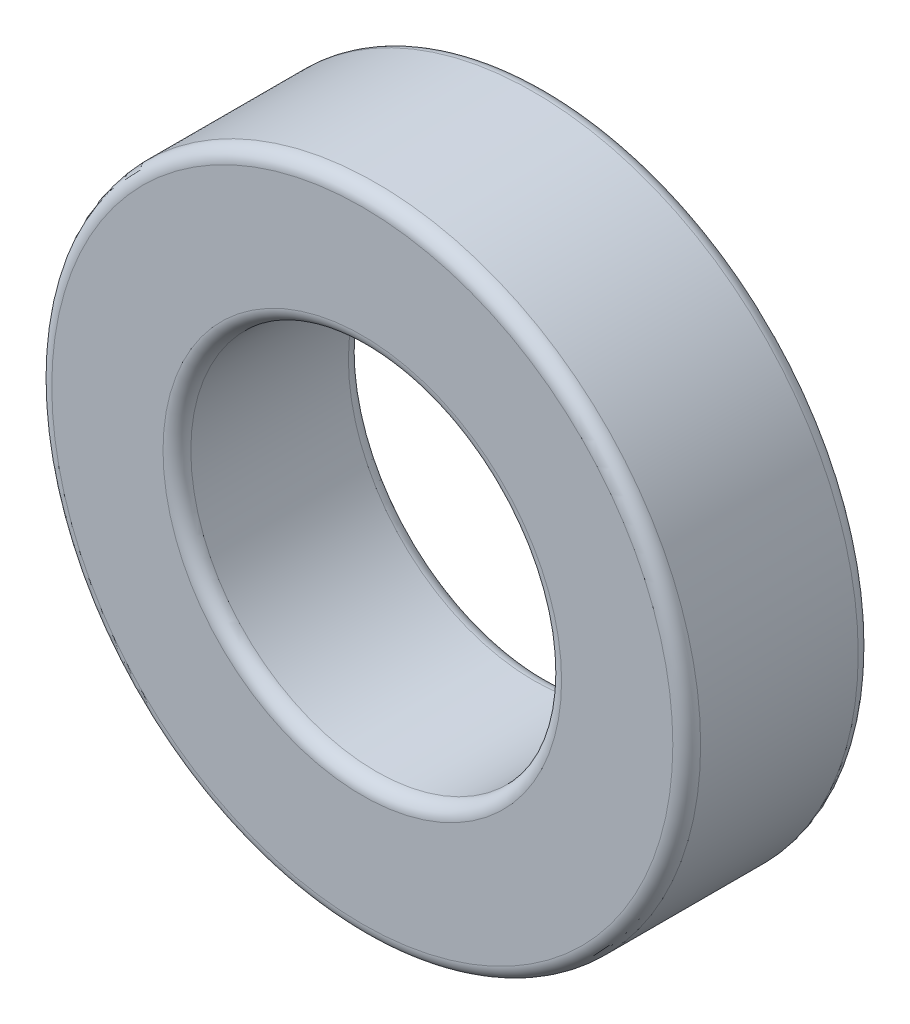
ISO-10303-21;
HEADER;
FILE_DESCRIPTION(('STEP AP214'),'2;1');
FILE_NAME('part.step','',(''),(''),'','','');
FILE_SCHEMA(('AUTOMOTIVE_DESIGN { 1 0 10303 214 1 1 1 1 }'));
ENDSEC;
DATA;
#1=APPLICATION_CONTEXT('core data for automotive mechanical design processes');
#2=APPLICATION_PROTOCOL_DEFINITION('international standard','automotive_design',2000,#1);
#3=PRODUCT_CONTEXT('',#1,'mechanical');
#4=PRODUCT('Part','Part','',(#3));
#5=PRODUCT_RELATED_PRODUCT_CATEGORY('part','',(#4));
#6=PRODUCT_DEFINITION_FORMATION('','',#4);
#7=PRODUCT_DEFINITION_CONTEXT('part definition',#1,'design');
#8=PRODUCT_DEFINITION('design','',#6,#7);
#9=PRODUCT_DEFINITION_SHAPE('','',#8);
#10=(LENGTH_UNIT() NAMED_UNIT(*) SI_UNIT(.MILLI.,.METRE.));
#11=(NAMED_UNIT(*) PLANE_ANGLE_UNIT() SI_UNIT($,.RADIAN.));
#12=(NAMED_UNIT(*) SI_UNIT($,.STERADIAN.) SOLID_ANGLE_UNIT());
#13=UNCERTAINTY_MEASURE_WITH_UNIT(LENGTH_MEASURE(1.E-05),#10,'distance_accuracy_value','');
#14=(GEOMETRIC_REPRESENTATION_CONTEXT(3) GLOBAL_UNCERTAINTY_ASSIGNED_CONTEXT((#13)) GLOBAL_UNIT_ASSIGNED_CONTEXT((#10,
#11,#12)) REPRESENTATION_CONTEXT('',''));
#15=CARTESIAN_POINT('',(0.,0.,0.));
#16=DIRECTION('',(0.,0.,1.));
#17=DIRECTION('',(1.,0.,0.));
#18=AXIS2_PLACEMENT_3D('',#15,#16,#17);
#19=CARTESIAN_POINT('',(0.,0.,4.));
#20=DIRECTION('',(0.,0.,1.));
#21=DIRECTION('',(1.,0.,0.));
#22=AXIS2_PLACEMENT_3D('',#19,#20,#21);
#23=PLANE('',#22);
#24=CARTESIAN_POINT('',(0.,0.,4.));
#25=DIRECTION('',(0.,0.,1.));
#26=DIRECTION('',(1.,0.,0.));
#27=AXIS2_PLACEMENT_3D('',#24,#25,#26);
#28=CIRCLE('',#27,4.3);
#29=CARTESIAN_POINT('',(4.3,0.,4.));
#30=VERTEX_POINT('',#29);
#31=EDGE_CURVE('E10',#30,#30,#28,.F.);
#32=ORIENTED_EDGE('',*,*,#31,.T.);
#33=EDGE_LOOP('',(#32));
#34=FACE_BOUND('',#33,.T.);
#35=CARTESIAN_POINT('',(0.,0.,4.));
#36=DIRECTION('',(0.,0.,1.));
#37=DIRECTION('',(1.,0.,0.));
#38=AXIS2_PLACEMENT_3D('',#35,#36,#37);
#39=CIRCLE('',#38,6.7);
#40=CARTESIAN_POINT('',(6.7,0.,4.));
#41=VERTEX_POINT('',#40);
#42=EDGE_CURVE('E38',#41,#41,#39,.T.);
#43=ORIENTED_EDGE('',*,*,#42,.T.);
#44=EDGE_LOOP('',(#43));
#45=FACE_BOUND('',#44,.T.);
#46=ADVANCED_FACE('F31',(#34,#45),#23,.T.);
#47=CARTESIAN_POINT('',(0.,0.,0.));
#48=DIRECTION('',(0.,0.,1.));
#49=DIRECTION('',(1.,0.,0.));
#50=AXIS2_PLACEMENT_3D('',#47,#48,#49);
#51=PLANE('',#50);
#52=CARTESIAN_POINT('',(0.,0.,0.));
#53=DIRECTION('',(0.,0.,1.));
#54=DIRECTION('',(1.,0.,0.));
#55=AXIS2_PLACEMENT_3D('',#52,#53,#54);
#56=CIRCLE('',#55,4.3);
#57=CARTESIAN_POINT('',(4.3,0.,0.));
#58=VERTEX_POINT('',#57);
#59=EDGE_CURVE('E57',#58,#58,#56,.T.);
#60=ORIENTED_EDGE('',*,*,#59,.T.);
#61=EDGE_LOOP('',(#60));
#62=FACE_BOUND('',#61,.T.);
#63=CARTESIAN_POINT('',(0.,0.,0.));
#64=DIRECTION('',(0.,0.,1.));
#65=DIRECTION('',(1.,0.,0.));
#66=AXIS2_PLACEMENT_3D('',#63,#64,#65);
#67=CIRCLE('',#66,6.7);
#68=CARTESIAN_POINT('',(6.7,0.,0.));
#69=VERTEX_POINT('',#68);
#70=EDGE_CURVE('E60',#69,#69,#67,.F.);
#71=ORIENTED_EDGE('',*,*,#70,.T.);
#72=EDGE_LOOP('',(#71));
#73=FACE_BOUND('',#72,.T.);
#74=ADVANCED_FACE('F64',(#62,#73),#51,.F.);
#75=CARTESIAN_POINT('',(0.,0.,4.));
#76=DIRECTION('',(0.,0.,-1.));
#77=DIRECTION('',(-1.,0.,0.));
#78=AXIS2_PLACEMENT_3D('',#75,#76,#77);
#79=CYLINDRICAL_SURFACE('',#78,7.);
#80=CARTESIAN_POINT('',(0.,0.,0.3));
#81=DIRECTION('',(0.,0.,1.));
#82=DIRECTION('',(1.,0.,0.));
#83=AXIS2_PLACEMENT_3D('',#80,#81,#82);
#84=CIRCLE('',#83,7.);
#85=CARTESIAN_POINT('',(7.,0.,0.3));
#86=VERTEX_POINT('',#85);
#87=EDGE_CURVE('E42',#86,#86,#84,.T.);
#88=ORIENTED_EDGE('',*,*,#87,.T.);
#89=EDGE_LOOP('',(#88));
#90=FACE_BOUND('',#89,.T.);
#91=CARTESIAN_POINT('',(0.,0.,3.7));
#92=DIRECTION('',(0.,0.,1.));
#93=DIRECTION('',(1.,0.,0.));
#94=AXIS2_PLACEMENT_3D('',#91,#92,#93);
#95=CIRCLE('',#94,7.);
#96=CARTESIAN_POINT('',(7.,0.,3.7));
#97=VERTEX_POINT('',#96);
#98=EDGE_CURVE('E46',#97,#97,#95,.F.);
#99=ORIENTED_EDGE('',*,*,#98,.T.);
#100=EDGE_LOOP('',(#99));
#101=FACE_BOUND('',#100,.T.);
#102=ADVANCED_FACE('F74',(#90,#101),#79,.T.);
#103=CARTESIAN_POINT('',(0.,0.,4.));
#104=DIRECTION('',(0.,0.,-1.));
#105=DIRECTION('',(-1.,0.,0.));
#106=AXIS2_PLACEMENT_3D('',#103,#104,#105);
#107=CYLINDRICAL_SURFACE('',#106,4.);
#108=CARTESIAN_POINT('',(0.,0.,0.3));
#109=DIRECTION('',(0.,0.,1.));
#110=DIRECTION('',(1.,0.,0.));
#111=AXIS2_PLACEMENT_3D('',#108,#109,#110);
#112=CIRCLE('',#111,4.);
#113=CARTESIAN_POINT('',(4.,0.,0.3));
#114=VERTEX_POINT('',#113);
#115=EDGE_CURVE('E51',#114,#114,#112,.F.);
#116=ORIENTED_EDGE('',*,*,#115,.T.);
#117=EDGE_LOOP('',(#116));
#118=FACE_BOUND('',#117,.T.);
#119=CARTESIAN_POINT('',(0.,0.,3.7));
#120=DIRECTION('',(0.,0.,1.));
#121=DIRECTION('',(1.,0.,0.));
#122=AXIS2_PLACEMENT_3D('',#119,#120,#121);
#123=CIRCLE('',#122,4.);
#124=CARTESIAN_POINT('',(4.,0.,3.7));
#125=VERTEX_POINT('',#124);
#126=EDGE_CURVE('E54',#125,#125,#123,.T.);
#127=ORIENTED_EDGE('',*,*,#126,.T.);
#128=EDGE_LOOP('',(#127));
#129=FACE_BOUND('',#128,.T.);
#130=ADVANCED_FACE('F77',(#118,#129),#107,.F.);
#131=CARTESIAN_POINT('',(0.,0.,0.3));
#132=DIRECTION('',(0.,0.,1.));
#133=DIRECTION('',(1.,0.,0.));
#134=AXIS2_PLACEMENT_3D('',#131,#132,#133);
#135=TOROIDAL_SURFACE('',#134,4.3,0.3);
#136=ORIENTED_EDGE('',*,*,#115,.F.);
#137=EDGE_LOOP('',(#136));
#138=FACE_BOUND('',#137,.T.);
#139=ORIENTED_EDGE('',*,*,#59,.F.);
#140=EDGE_LOOP('',(#139));
#141=FACE_BOUND('',#140,.T.);
#142=ADVANCED_FACE('F70',(#138,#141),#135,.T.);
#143=CARTESIAN_POINT('',(0.,0.,0.3));
#144=DIRECTION('',(0.,0.,1.));
#145=DIRECTION('',(1.,0.,0.));
#146=AXIS2_PLACEMENT_3D('',#143,#144,#145);
#147=TOROIDAL_SURFACE('',#146,6.7,0.3);
#148=ORIENTED_EDGE('',*,*,#70,.F.);
#149=EDGE_LOOP('',(#148));
#150=FACE_BOUND('',#149,.T.);
#151=ORIENTED_EDGE('',*,*,#87,.F.);
#152=EDGE_LOOP('',(#151));
#153=FACE_BOUND('',#152,.T.);
#154=ADVANCED_FACE('F66',(#150,#153),#147,.T.);
#155=CARTESIAN_POINT('',(0.,0.,3.7));
#156=DIRECTION('',(0.,0.,1.));
#157=DIRECTION('',(1.,0.,0.));
#158=AXIS2_PLACEMENT_3D('',#155,#156,#157);
#159=TOROIDAL_SURFACE('',#158,4.3,0.3);
#160=ORIENTED_EDGE('',*,*,#31,.F.);
#161=EDGE_LOOP('',(#160));
#162=FACE_BOUND('',#161,.T.);
#163=ORIENTED_EDGE('',*,*,#126,.F.);
#164=EDGE_LOOP('',(#163));
#165=FACE_BOUND('',#164,.T.);
#166=ADVANCED_FACE('F69',(#162,#165),#159,.T.);
#167=CARTESIAN_POINT('',(0.,0.,3.7));
#168=DIRECTION('',(0.,0.,1.));
#169=DIRECTION('',(1.,0.,0.));
#170=AXIS2_PLACEMENT_3D('',#167,#168,#169);
#171=TOROIDAL_SURFACE('',#170,6.7,0.3);
#172=ORIENTED_EDGE('',*,*,#98,.F.);
#173=EDGE_LOOP('',(#172));
#174=FACE_BOUND('',#173,.T.);
#175=ORIENTED_EDGE('',*,*,#42,.F.);
#176=EDGE_LOOP('',(#175));
#177=FACE_BOUND('',#176,.T.);
#178=ADVANCED_FACE('F33',(#174,#177),#171,.T.);
#179=CLOSED_SHELL('',(#46,#74,#102,#130,#142,#154,#166,#178));
#180=MANIFOLD_SOLID_BREP('B2',#179);
#181=ADVANCED_BREP_SHAPE_REPRESENTATION('',(#18,#180),#14);
#182=SHAPE_DEFINITION_REPRESENTATION(#9,#181);
ENDSEC;
END-ISO-10303-21;
